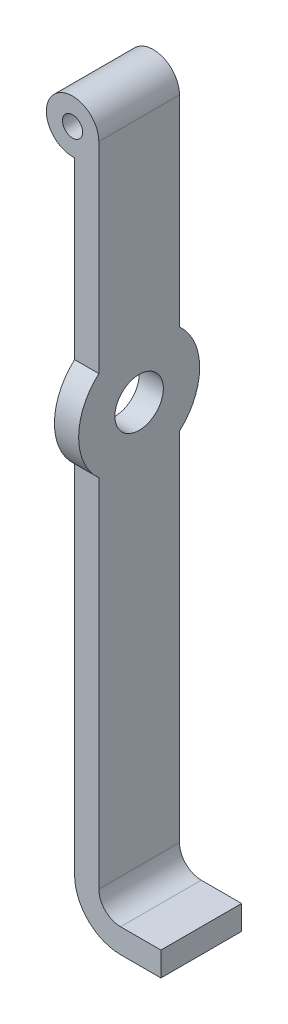
ISO-10303-21;
HEADER;
FILE_DESCRIPTION(('STEP AP214'),'2;1');
FILE_NAME('part.step','',(''),(''),'','','');
FILE_SCHEMA(('AUTOMOTIVE_DESIGN { 1 0 10303 214 1 1 1 1 }'));
ENDSEC;
DATA;
#1=APPLICATION_CONTEXT('core data for automotive mechanical design processes');
#2=APPLICATION_PROTOCOL_DEFINITION('international standard','automotive_design',2000,#1);
#3=PRODUCT_CONTEXT('',#1,'mechanical');
#4=PRODUCT('Part','Part','',(#3));
#5=PRODUCT_RELATED_PRODUCT_CATEGORY('part','',(#4));
#6=PRODUCT_DEFINITION_FORMATION('','',#4);
#7=PRODUCT_DEFINITION_CONTEXT('part definition',#1,'design');
#8=PRODUCT_DEFINITION('design','',#6,#7);
#9=PRODUCT_DEFINITION_SHAPE('','',#8);
#10=(LENGTH_UNIT() NAMED_UNIT(*) SI_UNIT(.MILLI.,.METRE.));
#11=(NAMED_UNIT(*) PLANE_ANGLE_UNIT() SI_UNIT($,.RADIAN.));
#12=(NAMED_UNIT(*) SI_UNIT($,.STERADIAN.) SOLID_ANGLE_UNIT());
#13=UNCERTAINTY_MEASURE_WITH_UNIT(LENGTH_MEASURE(1.E-05),#10,'distance_accuracy_value','');
#14=(GEOMETRIC_REPRESENTATION_CONTEXT(3) GLOBAL_UNCERTAINTY_ASSIGNED_CONTEXT((#13)) GLOBAL_UNIT_ASSIGNED_CONTEXT((#10,
#11,#12)) REPRESENTATION_CONTEXT('',''));
#15=CARTESIAN_POINT('',(0.,0.,0.));
#16=DIRECTION('',(0.,0.,1.));
#17=DIRECTION('',(1.,0.,0.));
#18=AXIS2_PLACEMENT_3D('',#15,#16,#17);
#19=CARTESIAN_POINT('',(0.,0.,10.));
#20=DIRECTION('',(0.,0.,1.));
#21=DIRECTION('',(1.,0.,0.));
#22=AXIS2_PLACEMENT_3D('',#19,#20,#21);
#23=PLANE('',#22);
#24=DIRECTION('',(-1.,0.,0.));
#25=VECTOR('',#24,1.);
#26=CARTESIAN_POINT('',(24.4632034355964,-24.9098300562505,10.));
#27=LINE('',#26,#25);
#28=CARTESIAN_POINT('',(3.25000000000001,-24.9098300562505,10.));
#29=VERTEX_POINT('',#28);
#30=CARTESIAN_POINT('',(0.250000000000003,-24.9098300562505,10.));
#31=VERTEX_POINT('',#30);
#32=EDGE_CURVE('E416',#29,#31,#27,.T.);
#33=ORIENTED_EDGE('',*,*,#32,.F.);
#34=DIRECTION('',(0.,1.,0.));
#35=VECTOR('',#34,1.);
#36=CARTESIAN_POINT('',(3.25000000000002,-80.2403703492039,10.));
#37=LINE('',#36,#35);
#38=CARTESIAN_POINT('',(3.25,0.,10.));
#39=VERTEX_POINT('',#38);
#40=EDGE_CURVE('E240',#29,#39,#37,.T.);
#41=ORIENTED_EDGE('',*,*,#40,.T.);
#42=CARTESIAN_POINT('',(0.,0.,10.));
#43=DIRECTION('',(0.,0.,1.));
#44=DIRECTION('',(1.,0.,0.));
#45=AXIS2_PLACEMENT_3D('',#42,#43,#44);
#46=CIRCLE('',#45,3.25);
#47=CARTESIAN_POINT('',(0.250000000000001,-3.24037034920393,10.));
#48=VERTEX_POINT('',#47);
#49=EDGE_CURVE('E159',#39,#48,#46,.T.);
#50=ORIENTED_EDGE('',*,*,#49,.T.);
#51=DIRECTION('',(0.,-1.,0.));
#52=VECTOR('',#51,1.);
#53=CARTESIAN_POINT('',(0.250000000000001,-3.24037034920393,10.));
#54=LINE('',#53,#52);
#55=EDGE_CURVE('E63',#48,#31,#54,.T.);
#56=ORIENTED_EDGE('',*,*,#55,.T.);
#57=EDGE_LOOP('',(#33,#41,#50,#56));
#58=FACE_BOUND('',#57,.T.);
#59=CARTESIAN_POINT('',(0.,0.,10.));
#60=DIRECTION('',(0.,0.,1.));
#61=DIRECTION('',(1.,0.,0.));
#62=AXIS2_PLACEMENT_3D('',#59,#60,#61);
#63=CIRCLE('',#62,1.25);
#64=CARTESIAN_POINT('',(1.25,0.,10.));
#65=VERTEX_POINT('',#64);
#66=EDGE_CURVE('E250',#65,#65,#63,.T.);
#67=ORIENTED_EDGE('',*,*,#66,.F.);
#68=EDGE_LOOP('',(#67));
#69=FACE_BOUND('',#68,.T.);
#70=ADVANCED_FACE('F39',(#58,#69),#23,.T.);
#71=CARTESIAN_POINT('',(0.,0.,0.));
#72=DIRECTION('',(0.,0.,1.));
#73=DIRECTION('',(1.,0.,0.));
#74=AXIS2_PLACEMENT_3D('',#71,#72,#73);
#75=PLANE('',#74);
#76=CARTESIAN_POINT('',(0.,0.,0.));
#77=DIRECTION('',(0.,0.,1.));
#78=DIRECTION('',(1.,0.,0.));
#79=AXIS2_PLACEMENT_3D('',#76,#77,#78);
#80=CIRCLE('',#79,1.25);
#81=CARTESIAN_POINT('',(1.25,0.,0.));
#82=VERTEX_POINT('',#81);
#83=EDGE_CURVE('E257',#82,#82,#80,.T.);
#84=ORIENTED_EDGE('',*,*,#83,.T.);
#85=EDGE_LOOP('',(#84));
#86=FACE_BOUND('',#85,.T.);
#87=DIRECTION('',(0.,1.,0.));
#88=VECTOR('',#87,1.);
#89=CARTESIAN_POINT('',(3.25000000000002,-80.2403703492039,0.));
#90=LINE('',#89,#88);
#91=CARTESIAN_POINT('',(3.25000000000001,-24.9098300562505,0.));
#92=VERTEX_POINT('',#91);
#93=CARTESIAN_POINT('',(3.25,0.,0.));
#94=VERTEX_POINT('',#93);
#95=EDGE_CURVE('E160',#92,#94,#90,.T.);
#96=ORIENTED_EDGE('',*,*,#95,.F.);
#97=DIRECTION('',(-1.,0.,0.));
#98=VECTOR('',#97,1.);
#99=CARTESIAN_POINT('',(24.4632034355964,-24.9098300562505,0.));
#100=LINE('',#99,#98);
#101=CARTESIAN_POINT('',(0.250000000000004,-24.9098300562505,0.));
#102=VERTEX_POINT('',#101);
#103=EDGE_CURVE('E135',#92,#102,#100,.T.);
#104=ORIENTED_EDGE('',*,*,#103,.T.);
#105=DIRECTION('',(0.,-1.,0.));
#106=VECTOR('',#105,1.);
#107=CARTESIAN_POINT('',(0.250000000000001,-3.24037034920393,0.));
#108=LINE('',#107,#106);
#109=CARTESIAN_POINT('',(0.250000000000001,-3.24037034920393,0.));
#110=VERTEX_POINT('',#109);
#111=EDGE_CURVE('E206',#110,#102,#108,.T.);
#112=ORIENTED_EDGE('',*,*,#111,.F.);
#113=CARTESIAN_POINT('',(0.,0.,0.));
#114=DIRECTION('',(0.,0.,1.));
#115=DIRECTION('',(1.,0.,0.));
#116=AXIS2_PLACEMENT_3D('',#113,#114,#115);
#117=CIRCLE('',#116,3.25);
#118=EDGE_CURVE('E247',#94,#110,#117,.T.);
#119=ORIENTED_EDGE('',*,*,#118,.F.);
#120=EDGE_LOOP('',(#96,#104,#112,#119));
#121=FACE_BOUND('',#120,.T.);
#122=ADVANCED_FACE('F286',(#86,#121),#75,.F.);
#123=DIRECTION('',(-1.,0.,0.));
#124=VECTOR('',#123,1.);
#125=CARTESIAN_POINT('',(24.4632034355964,-36.0901699437495,10.));
#126=LINE('',#125,#124);
#127=CARTESIAN_POINT('',(0.250000000000004,-36.0901699437495,10.));
#128=VERTEX_POINT('',#127);
#129=CARTESIAN_POINT('',(3.25000000000001,-36.0901699437495,10.));
#130=VERTEX_POINT('',#129);
#131=EDGE_CURVE('E55',#128,#130,#126,.F.);
#132=ORIENTED_EDGE('',*,*,#131,.F.);
#133=CARTESIAN_POINT('',(0.25000000000001,-80.2403703492039,10.));
#134=VERTEX_POINT('',#133);
#135=EDGE_CURVE('E164',#128,#134,#54,.T.);
#136=ORIENTED_EDGE('',*,*,#135,.T.);
#137=CARTESIAN_POINT('',(5.95000000000001,-80.2403703492039,10.));
#138=DIRECTION('',(0.,0.,1.));
#139=DIRECTION('',(1.,0.,0.));
#140=AXIS2_PLACEMENT_3D('',#137,#138,#139);
#141=CIRCLE('',#140,5.7);
#142=CARTESIAN_POINT('',(5.95000000000001,-85.9403703492039,10.));
#143=VERTEX_POINT('',#142);
#144=EDGE_CURVE('E200',#134,#143,#141,.T.);
#145=ORIENTED_EDGE('',*,*,#144,.T.);
#146=DIRECTION('',(1.,0.,0.));
#147=VECTOR('',#146,1.);
#148=CARTESIAN_POINT('',(10.95,-85.9403703492039,10.));
#149=LINE('',#148,#147);
#150=CARTESIAN_POINT('',(10.95,-85.9403703492039,10.));
#151=VERTEX_POINT('',#150);
#152=EDGE_CURVE('E242',#143,#151,#149,.T.);
#153=ORIENTED_EDGE('',*,*,#152,.T.);
#154=DIRECTION('',(0.,1.,0.));
#155=VECTOR('',#154,1.);
#156=CARTESIAN_POINT('',(10.95,-82.9403703492039,10.));
#157=LINE('',#156,#155);
#158=CARTESIAN_POINT('',(10.95,-82.9403703492039,10.));
#159=VERTEX_POINT('',#158);
#160=EDGE_CURVE('E236',#151,#159,#157,.T.);
#161=ORIENTED_EDGE('',*,*,#160,.T.);
#162=DIRECTION('',(-1.,0.,0.));
#163=VECTOR('',#162,1.);
#164=CARTESIAN_POINT('',(5.95000000000001,-82.9403703492039,10.));
#165=LINE('',#164,#163);
#166=CARTESIAN_POINT('',(5.95000000000001,-82.9403703492039,10.));
#167=VERTEX_POINT('',#166);
#168=EDGE_CURVE('E233',#159,#167,#165,.T.);
#169=ORIENTED_EDGE('',*,*,#168,.T.);
#170=CARTESIAN_POINT('',(5.95000000000001,-80.2403703492039,10.));
#171=DIRECTION('',(0.,0.,-1.));
#172=DIRECTION('',(1.,0.,0.));
#173=AXIS2_PLACEMENT_3D('',#170,#171,#172);
#174=CIRCLE('',#173,2.69999999999999);
#175=CARTESIAN_POINT('',(3.25000000000002,-80.2403703492039,10.));
#176=VERTEX_POINT('',#175);
#177=EDGE_CURVE('E235',#167,#176,#174,.T.);
#178=ORIENTED_EDGE('',*,*,#177,.T.);
#179=EDGE_CURVE('E174',#176,#130,#37,.T.);
#180=ORIENTED_EDGE('',*,*,#179,.T.);
#181=EDGE_LOOP('',(#132,#136,#145,#153,#161,#169,#178,#180));
#182=FACE_BOUND('',#181,.T.);
#183=ADVANCED_FACE('F273',(#182),#23,.T.);
#184=CARTESIAN_POINT('',(0.250000000000005,-36.0901699437495,0.));
#185=VERTEX_POINT('',#184);
#186=CARTESIAN_POINT('',(0.25000000000001,-80.2403703492039,0.));
#187=VERTEX_POINT('',#186);
#188=EDGE_CURVE('E149',#185,#187,#108,.T.);
#189=ORIENTED_EDGE('',*,*,#188,.F.);
#190=DIRECTION('',(-1.,0.,0.));
#191=VECTOR('',#190,1.);
#192=CARTESIAN_POINT('',(24.4632034355964,-36.0901699437495,0.));
#193=LINE('',#192,#191);
#194=CARTESIAN_POINT('',(3.25000000000001,-36.0901699437495,0.));
#195=VERTEX_POINT('',#194);
#196=EDGE_CURVE('E132',#185,#195,#193,.F.);
#197=ORIENTED_EDGE('',*,*,#196,.T.);
#198=CARTESIAN_POINT('',(3.25000000000002,-80.2403703492039,0.));
#199=VERTEX_POINT('',#198);
#200=EDGE_CURVE('E147',#199,#195,#90,.T.);
#201=ORIENTED_EDGE('',*,*,#200,.F.);
#202=CARTESIAN_POINT('',(5.95000000000001,-80.2403703492039,0.));
#203=DIRECTION('',(0.,0.,-1.));
#204=DIRECTION('',(1.,0.,0.));
#205=AXIS2_PLACEMENT_3D('',#202,#203,#204);
#206=CIRCLE('',#205,2.69999999999999);
#207=CARTESIAN_POINT('',(5.95000000000001,-82.9403703492039,0.));
#208=VERTEX_POINT('',#207);
#209=EDGE_CURVE('E166',#208,#199,#206,.T.);
#210=ORIENTED_EDGE('',*,*,#209,.F.);
#211=DIRECTION('',(-1.,0.,0.));
#212=VECTOR('',#211,1.);
#213=CARTESIAN_POINT('',(5.95000000000001,-82.9403703492039,0.));
#214=LINE('',#213,#212);
#215=CARTESIAN_POINT('',(10.95,-82.9403703492039,0.));
#216=VERTEX_POINT('',#215);
#217=EDGE_CURVE('E217',#216,#208,#214,.T.);
#218=ORIENTED_EDGE('',*,*,#217,.F.);
#219=DIRECTION('',(0.,1.,0.));
#220=VECTOR('',#219,1.);
#221=CARTESIAN_POINT('',(10.95,-82.9403703492039,0.));
#222=LINE('',#221,#220);
#223=CARTESIAN_POINT('',(10.95,-85.9403703492039,0.));
#224=VERTEX_POINT('',#223);
#225=EDGE_CURVE('E210',#224,#216,#222,.T.);
#226=ORIENTED_EDGE('',*,*,#225,.F.);
#227=DIRECTION('',(1.,0.,0.));
#228=VECTOR('',#227,1.);
#229=CARTESIAN_POINT('',(10.95,-85.9403703492039,0.));
#230=LINE('',#229,#228);
#231=CARTESIAN_POINT('',(5.95000000000001,-85.9403703492039,0.));
#232=VERTEX_POINT('',#231);
#233=EDGE_CURVE('E204',#232,#224,#230,.T.);
#234=ORIENTED_EDGE('',*,*,#233,.F.);
#235=CARTESIAN_POINT('',(5.95000000000001,-80.2403703492039,0.));
#236=DIRECTION('',(0.,0.,1.));
#237=DIRECTION('',(1.,0.,0.));
#238=AXIS2_PLACEMENT_3D('',#235,#236,#237);
#239=CIRCLE('',#238,5.7);
#240=EDGE_CURVE('E199',#187,#232,#239,.T.);
#241=ORIENTED_EDGE('',*,*,#240,.F.);
#242=EDGE_LOOP('',(#189,#197,#201,#210,#218,#226,#234,#241));
#243=FACE_BOUND('',#242,.T.);
#244=ADVANCED_FACE('F145',(#243),#75,.F.);
#245=CARTESIAN_POINT('',(0.,0.,10.));
#246=DIRECTION('',(0.,0.,-1.));
#247=DIRECTION('',(-1.,0.,0.));
#248=AXIS2_PLACEMENT_3D('',#245,#246,#247);
#249=CYLINDRICAL_SURFACE('',#248,3.25);
#250=ORIENTED_EDGE('',*,*,#118,.T.);
#251=DIRECTION('',(0.,0.,-1.));
#252=VECTOR('',#251,1.);
#253=CARTESIAN_POINT('',(0.250000000000001,-3.24037034920393,10.));
#254=LINE('',#253,#252);
#255=EDGE_CURVE('E11',#48,#110,#254,.T.);
#256=ORIENTED_EDGE('',*,*,#255,.F.);
#257=ORIENTED_EDGE('',*,*,#49,.F.);
#258=DIRECTION('',(0.,0.,-1.));
#259=VECTOR('',#258,1.);
#260=CARTESIAN_POINT('',(3.25,0.,10.));
#261=LINE('',#260,#259);
#262=EDGE_CURVE('E170',#39,#94,#261,.T.);
#263=ORIENTED_EDGE('',*,*,#262,.T.);
#264=EDGE_LOOP('',(#250,#256,#257,#263));
#265=FACE_BOUND('',#264,.T.);
#266=ADVANCED_FACE('F41',(#265),#249,.T.);
#267=CARTESIAN_POINT('',(0.250000000000001,-3.24037034920393,10.));
#268=DIRECTION('',(1.,0.,0.));
#269=DIRECTION('',(0.,1.,0.));
#270=AXIS2_PLACEMENT_3D('',#267,#268,#269);
#271=PLANE('',#270);
#272=ORIENTED_EDGE('',*,*,#111,.T.);
#273=CARTESIAN_POINT('',(0.250000000000004,-30.5,5.));
#274=DIRECTION('',(-1.,0.,0.));
#275=DIRECTION('',(0.,-1.,0.));
#276=AXIS2_PLACEMENT_3D('',#273,#274,#275);
#277=CIRCLE('',#276,7.5);
#278=EDGE_CURVE('E421',#102,#185,#277,.T.);
#279=ORIENTED_EDGE('',*,*,#278,.T.);
#280=ORIENTED_EDGE('',*,*,#188,.T.);
#281=DIRECTION('',(0.,0.,-1.));
#282=VECTOR('',#281,1.);
#283=CARTESIAN_POINT('',(0.25000000000001,-80.2403703492039,10.));
#284=LINE('',#283,#282);
#285=EDGE_CURVE('E48',#134,#187,#284,.T.);
#286=ORIENTED_EDGE('',*,*,#285,.F.);
#287=ORIENTED_EDGE('',*,*,#135,.F.);
#288=EDGE_CURVE('E419',#128,#31,#277,.T.);
#289=ORIENTED_EDGE('',*,*,#288,.T.);
#290=ORIENTED_EDGE('',*,*,#55,.F.);
#291=ORIENTED_EDGE('',*,*,#255,.T.);
#292=EDGE_LOOP('',(#272,#279,#280,#286,#287,#289,#290,#291));
#293=FACE_BOUND('',#292,.T.);
#294=CARTESIAN_POINT('',(0.250000000000004,-30.5,5.));
#295=DIRECTION('',(-1.,0.,0.));
#296=DIRECTION('',(0.,-1.,0.));
#297=AXIS2_PLACEMENT_3D('',#294,#295,#296);
#298=CIRCLE('',#297,3.);
#299=CARTESIAN_POINT('',(0.250000000000005,-33.5,5.));
#300=VERTEX_POINT('',#299);
#301=EDGE_CURVE('E429',#300,#300,#298,.T.);
#302=ORIENTED_EDGE('',*,*,#301,.F.);
#303=EDGE_LOOP('',(#302));
#304=FACE_BOUND('',#303,.T.);
#305=ADVANCED_FACE('F283',(#293,#304),#271,.F.);
#306=CARTESIAN_POINT('',(5.95000000000001,-80.2403703492039,10.));
#307=DIRECTION('',(0.,0.,-1.));
#308=DIRECTION('',(-1.,0.,0.));
#309=AXIS2_PLACEMENT_3D('',#306,#307,#308);
#310=CYLINDRICAL_SURFACE('',#309,5.7);
#311=ORIENTED_EDGE('',*,*,#240,.T.);
#312=DIRECTION('',(0.,0.,-1.));
#313=VECTOR('',#312,1.);
#314=CARTESIAN_POINT('',(5.95000000000001,-85.9403703492039,10.));
#315=LINE('',#314,#313);
#316=EDGE_CURVE('E189',#143,#232,#315,.T.);
#317=ORIENTED_EDGE('',*,*,#316,.F.);
#318=ORIENTED_EDGE('',*,*,#144,.F.);
#319=ORIENTED_EDGE('',*,*,#285,.T.);
#320=EDGE_LOOP('',(#311,#317,#318,#319));
#321=FACE_BOUND('',#320,.T.);
#322=ADVANCED_FACE('F197',(#321),#310,.T.);
#323=CARTESIAN_POINT('',(10.95,-85.9403703492039,10.));
#324=DIRECTION('',(0.,1.,0.));
#325=DIRECTION('',(0.,0.,1.));
#326=AXIS2_PLACEMENT_3D('',#323,#324,#325);
#327=PLANE('',#326);
#328=ORIENTED_EDGE('',*,*,#233,.T.);
#329=DIRECTION('',(0.,0.,-1.));
#330=VECTOR('',#329,1.);
#331=CARTESIAN_POINT('',(10.95,-85.9403703492039,10.));
#332=LINE('',#331,#330);
#333=EDGE_CURVE('E185',#151,#224,#332,.T.);
#334=ORIENTED_EDGE('',*,*,#333,.F.);
#335=ORIENTED_EDGE('',*,*,#152,.F.);
#336=ORIENTED_EDGE('',*,*,#316,.T.);
#337=EDGE_LOOP('',(#328,#334,#335,#336));
#338=FACE_BOUND('',#337,.T.);
#339=ADVANCED_FACE('F275',(#338),#327,.F.);
#340=CARTESIAN_POINT('',(10.95,-82.9403703492039,10.));
#341=DIRECTION('',(-1.,0.,0.));
#342=DIRECTION('',(0.,0.,1.));
#343=AXIS2_PLACEMENT_3D('',#340,#341,#342);
#344=PLANE('',#343);
#345=ORIENTED_EDGE('',*,*,#225,.T.);
#346=DIRECTION('',(0.,0.,-1.));
#347=VECTOR('',#346,1.);
#348=CARTESIAN_POINT('',(10.95,-82.9403703492039,10.));
#349=LINE('',#348,#347);
#350=EDGE_CURVE('E181',#159,#216,#349,.T.);
#351=ORIENTED_EDGE('',*,*,#350,.F.);
#352=ORIENTED_EDGE('',*,*,#160,.F.);
#353=ORIENTED_EDGE('',*,*,#333,.T.);
#354=EDGE_LOOP('',(#345,#351,#352,#353));
#355=FACE_BOUND('',#354,.T.);
#356=ADVANCED_FACE('F228',(#355),#344,.F.);
#357=CARTESIAN_POINT('',(5.95000000000001,-82.9403703492039,10.));
#358=DIRECTION('',(0.,-1.,0.));
#359=DIRECTION('',(0.,0.,-1.));
#360=AXIS2_PLACEMENT_3D('',#357,#358,#359);
#361=PLANE('',#360);
#362=ORIENTED_EDGE('',*,*,#217,.T.);
#363=DIRECTION('',(0.,0.,-1.));
#364=VECTOR('',#363,1.);
#365=CARTESIAN_POINT('',(5.95000000000001,-82.9403703492039,10.));
#366=LINE('',#365,#364);
#367=EDGE_CURVE('E177',#167,#208,#366,.T.);
#368=ORIENTED_EDGE('',*,*,#367,.F.);
#369=ORIENTED_EDGE('',*,*,#168,.F.);
#370=ORIENTED_EDGE('',*,*,#350,.T.);
#371=EDGE_LOOP('',(#362,#368,#369,#370));
#372=FACE_BOUND('',#371,.T.);
#373=ADVANCED_FACE('F232',(#372),#361,.F.);
#374=CARTESIAN_POINT('',(5.95000000000001,-80.2403703492039,10.));
#375=DIRECTION('',(0.,0.,-1.));
#376=DIRECTION('',(-1.,0.,0.));
#377=AXIS2_PLACEMENT_3D('',#374,#375,#376);
#378=CYLINDRICAL_SURFACE('',#377,2.69999999999999);
#379=ORIENTED_EDGE('',*,*,#209,.T.);
#380=DIRECTION('',(0.,0.,-1.));
#381=VECTOR('',#380,1.);
#382=CARTESIAN_POINT('',(3.25000000000002,-80.2403703492039,10.));
#383=LINE('',#382,#381);
#384=EDGE_CURVE('E157',#176,#199,#383,.T.);
#385=ORIENTED_EDGE('',*,*,#384,.F.);
#386=ORIENTED_EDGE('',*,*,#177,.F.);
#387=ORIENTED_EDGE('',*,*,#367,.T.);
#388=EDGE_LOOP('',(#379,#385,#386,#387));
#389=FACE_BOUND('',#388,.T.);
#390=ADVANCED_FACE('F224',(#389),#378,.F.);
#391=CARTESIAN_POINT('',(3.25000000000002,-80.2403703492039,10.));
#392=DIRECTION('',(-1.,0.,0.));
#393=DIRECTION('',(0.,-1.,0.));
#394=AXIS2_PLACEMENT_3D('',#391,#392,#393);
#395=PLANE('',#394);
#396=ORIENTED_EDGE('',*,*,#200,.T.);
#397=CARTESIAN_POINT('',(3.25000000000001,-30.5,5.));
#398=DIRECTION('',(-1.,0.,0.));
#399=DIRECTION('',(0.,-1.,0.));
#400=AXIS2_PLACEMENT_3D('',#397,#398,#399);
#401=CIRCLE('',#400,7.5);
#402=EDGE_CURVE('E129',#195,#92,#401,.F.);
#403=ORIENTED_EDGE('',*,*,#402,.T.);
#404=ORIENTED_EDGE('',*,*,#95,.T.);
#405=ORIENTED_EDGE('',*,*,#262,.F.);
#406=ORIENTED_EDGE('',*,*,#40,.F.);
#407=EDGE_CURVE('E140',#29,#130,#401,.F.);
#408=ORIENTED_EDGE('',*,*,#407,.T.);
#409=ORIENTED_EDGE('',*,*,#179,.F.);
#410=ORIENTED_EDGE('',*,*,#384,.T.);
#411=EDGE_LOOP('',(#396,#403,#404,#405,#406,#408,#409,#410));
#412=FACE_BOUND('',#411,.T.);
#413=CARTESIAN_POINT('',(3.25000000000001,-30.5,5.));
#414=DIRECTION('',(-1.,0.,0.));
#415=DIRECTION('',(0.,-1.,0.));
#416=AXIS2_PLACEMENT_3D('',#413,#414,#415);
#417=CIRCLE('',#416,3.);
#418=CARTESIAN_POINT('',(3.25000000000001,-33.5,5.));
#419=VERTEX_POINT('',#418);
#420=EDGE_CURVE('E263',#419,#419,#417,.F.);
#421=ORIENTED_EDGE('',*,*,#420,.F.);
#422=EDGE_LOOP('',(#421));
#423=FACE_BOUND('',#422,.T.);
#424=ADVANCED_FACE('F153',(#412,#423),#395,.F.);
#425=CARTESIAN_POINT('',(0.,0.,10.));
#426=DIRECTION('',(0.,0.,-1.));
#427=DIRECTION('',(-1.,0.,0.));
#428=AXIS2_PLACEMENT_3D('',#425,#426,#427);
#429=CYLINDRICAL_SURFACE('',#428,1.25);
#430=ORIENTED_EDGE('',*,*,#66,.T.);
#431=EDGE_LOOP('',(#430));
#432=FACE_BOUND('',#431,.T.);
#433=ORIENTED_EDGE('',*,*,#83,.F.);
#434=EDGE_LOOP('',(#433));
#435=FACE_BOUND('',#434,.T.);
#436=ADVANCED_FACE('F307',(#432,#435),#429,.F.);
#437=CARTESIAN_POINT('',(10.951,-30.5,5.));
#438=DIRECTION('',(-1.,0.,0.));
#439=DIRECTION('',(0.,-1.,0.));
#440=AXIS2_PLACEMENT_3D('',#437,#438,#439);
#441=CYLINDRICAL_SURFACE('',#440,3.);
#442=CARTESIAN_POINT('',(0.250000000000005,-33.5,5.));
#443=CARTESIAN_POINT('',(0.281250000000005,-33.5,5.));
#444=CARTESIAN_POINT('',(0.312500000000005,-33.5,5.));
#445=CARTESIAN_POINT('',(0.375000000000006,-33.5,5.));
#446=CARTESIAN_POINT('',(0.406250000000006,-33.5,5.));
#447=CARTESIAN_POINT('',(0.468750000000006,-33.5,5.));
#448=CARTESIAN_POINT('',(0.500000000000006,-33.5,5.));
#449=CARTESIAN_POINT('',(0.562500000000006,-33.5,5.));
#450=CARTESIAN_POINT('',(0.593750000000006,-33.5,5.));
#451=CARTESIAN_POINT('',(0.656250000000006,-33.5,5.));
#452=CARTESIAN_POINT('',(0.687500000000006,-33.5,5.));
#453=CARTESIAN_POINT('',(0.750000000000006,-33.5,5.));
#454=CARTESIAN_POINT('',(0.781250000000006,-33.5,5.));
#455=CARTESIAN_POINT('',(0.843750000000006,-33.5,5.));
#456=CARTESIAN_POINT('',(0.875000000000006,-33.5,5.));
#457=CARTESIAN_POINT('',(0.937500000000006,-33.5,5.));
#458=CARTESIAN_POINT('',(0.968750000000006,-33.5,5.));
#459=CARTESIAN_POINT('',(1.03125000000001,-33.5,5.));
#460=CARTESIAN_POINT('',(1.06250000000001,-33.5,5.));
#461=CARTESIAN_POINT('',(1.12500000000001,-33.5,5.));
#462=CARTESIAN_POINT('',(1.15625000000001,-33.5,5.));
#463=CARTESIAN_POINT('',(1.21875000000001,-33.5,5.));
#464=CARTESIAN_POINT('',(1.25000000000001,-33.5,5.));
#465=CARTESIAN_POINT('',(1.31250000000001,-33.5,5.));
#466=CARTESIAN_POINT('',(1.34375000000001,-33.5,5.));
#467=CARTESIAN_POINT('',(1.40625000000001,-33.5,5.));
#468=CARTESIAN_POINT('',(1.43750000000001,-33.5,5.));
#469=CARTESIAN_POINT('',(1.50000000000001,-33.5,5.));
#470=CARTESIAN_POINT('',(1.53125000000001,-33.5,5.));
#471=CARTESIAN_POINT('',(1.59375000000001,-33.5,5.));
#472=CARTESIAN_POINT('',(1.62500000000001,-33.5,5.));
#473=CARTESIAN_POINT('',(1.68750000000001,-33.5,5.));
#474=CARTESIAN_POINT('',(1.71875000000001,-33.5,5.));
#475=CARTESIAN_POINT('',(1.78125000000001,-33.5,5.));
#476=CARTESIAN_POINT('',(1.81250000000001,-33.5,5.));
#477=CARTESIAN_POINT('',(1.87500000000001,-33.5,5.));
#478=CARTESIAN_POINT('',(1.90625000000001,-33.5,5.));
#479=CARTESIAN_POINT('',(1.96875000000001,-33.5,5.));
#480=CARTESIAN_POINT('',(2.00000000000001,-33.5,5.));
#481=CARTESIAN_POINT('',(2.06250000000001,-33.5,5.));
#482=CARTESIAN_POINT('',(2.09375000000001,-33.5,5.));
#483=CARTESIAN_POINT('',(2.15625000000001,-33.5,5.));
#484=CARTESIAN_POINT('',(2.18750000000001,-33.5,5.));
#485=CARTESIAN_POINT('',(2.25000000000001,-33.5,5.));
#486=CARTESIAN_POINT('',(2.28125000000001,-33.5,5.));
#487=CARTESIAN_POINT('',(2.34375000000001,-33.5,5.));
#488=CARTESIAN_POINT('',(2.37500000000001,-33.5,5.));
#489=CARTESIAN_POINT('',(2.43750000000001,-33.5,5.));
#490=CARTESIAN_POINT('',(2.46875000000001,-33.5,5.));
#491=CARTESIAN_POINT('',(2.53125000000001,-33.5,5.));
#492=CARTESIAN_POINT('',(2.56250000000001,-33.5,5.));
#493=CARTESIAN_POINT('',(2.62500000000001,-33.5,5.));
#494=CARTESIAN_POINT('',(2.65625000000001,-33.5,5.));
#495=CARTESIAN_POINT('',(2.71875000000001,-33.5,5.));
#496=CARTESIAN_POINT('',(2.75000000000001,-33.5,5.));
#497=CARTESIAN_POINT('',(2.81250000000001,-33.5,5.));
#498=CARTESIAN_POINT('',(2.84375000000001,-33.5,5.));
#499=CARTESIAN_POINT('',(2.90625000000001,-33.5,5.));
#500=CARTESIAN_POINT('',(2.93750000000001,-33.5,5.));
#501=CARTESIAN_POINT('',(3.00000000000001,-33.5,5.));
#502=CARTESIAN_POINT('',(3.03125000000001,-33.5,5.));
#503=CARTESIAN_POINT('',(3.09375000000001,-33.5,5.));
#504=CARTESIAN_POINT('',(3.12500000000001,-33.5,5.));
#505=CARTESIAN_POINT('',(3.18750000000001,-33.5,5.));
#506=CARTESIAN_POINT('',(3.21875000000001,-33.5,5.));
#507=CARTESIAN_POINT('',(3.25000000000001,-33.5,5.));
#508=B_SPLINE_CURVE_WITH_KNOTS('',3,(#442,#443,#444,#445,#446,#447,#448,#449,#450,#451,#452,
#453,#454,#455,#456,#457,#458,#459,#460,#461,#462,#463,#464,#465,#466,#467,#468,#469,#470,#471,
#472,#473,#474,#475,#476,#477,#478,#479,#480,#481,#482,#483,#484,#485,#486,#487,#488,#489,#490,
#491,#492,#493,#494,#495,#496,#497,#498,#499,#500,#501,#502,#503,#504,#505,#506,#507),
.UNSPECIFIED.,.F.,.F.,(4,2,2,2,2,2,2,2,2,2,2,2,2,2,2,2,2,2,2,2,2,2,2,2,2,2,2,2,2,2,2,2,4),(0.,
0.0937500000000001,0.1875,0.28125,0.375,0.46875,0.5625,0.656250000000001,0.750000000000001,
0.843750000000001,0.937500000000001,1.03125,1.125,1.21875,1.3125,1.40625,1.5,1.59375,1.6875,
1.78125,1.875,1.96875,2.0625,2.15625,2.25,2.34375,2.4375,2.53125,2.625,2.71875,2.8125,2.90625,
3.),.UNSPECIFIED.);
#509=EDGE_CURVE('BSEAM325',#300,#419,#508,.T.);
#510=ORIENTED_EDGE('',*,*,#301,.T.);
#511=ORIENTED_EDGE('',*,*,#420,.T.);
#512=ORIENTED_EDGE('',*,*,#509,.T.);
#513=ORIENTED_EDGE('',*,*,#509,.F.);
#514=EDGE_LOOP('',(#510,#512,#511,#513));
#515=FACE_BOUND('',#514,.T.);
#516=ADVANCED_FACE('F325',(#515),#441,.F.);
#517=CARTESIAN_POINT('',(24.4632034355964,-30.5,5.));
#518=DIRECTION('',(-1.,0.,0.));
#519=DIRECTION('',(0.,-1.,0.));
#520=AXIS2_PLACEMENT_3D('',#517,#518,#519);
#521=CYLINDRICAL_SURFACE('',#520,7.5);
#522=ORIENTED_EDGE('',*,*,#103,.F.);
#523=ORIENTED_EDGE('',*,*,#402,.F.);
#524=ORIENTED_EDGE('',*,*,#196,.F.);
#525=ORIENTED_EDGE('',*,*,#278,.F.);
#526=EDGE_LOOP('',(#522,#523,#524,#525));
#527=FACE_BOUND('',#526,.T.);
#528=ADVANCED_FACE('F131',(#527),#521,.T.);
#529=ORIENTED_EDGE('',*,*,#407,.F.);
#530=ORIENTED_EDGE('',*,*,#32,.T.);
#531=ORIENTED_EDGE('',*,*,#288,.F.);
#532=ORIENTED_EDGE('',*,*,#131,.T.);
#533=EDGE_LOOP('',(#529,#530,#531,#532));
#534=FACE_BOUND('',#533,.T.);
#535=ADVANCED_FACE('F354',(#534),#521,.T.);
#536=CLOSED_SHELL('',(#70,#122,#183,#244,#266,#305,#322,#339,#356,#373,#390,#424,#436,#516,#528,#535));
#537=MANIFOLD_SOLID_BREP('B2',#536);
#538=ADVANCED_BREP_SHAPE_REPRESENTATION('',(#18,#537),#14);
#539=SHAPE_DEFINITION_REPRESENTATION(#9,#538);
ENDSEC;
END-ISO-10303-21;
